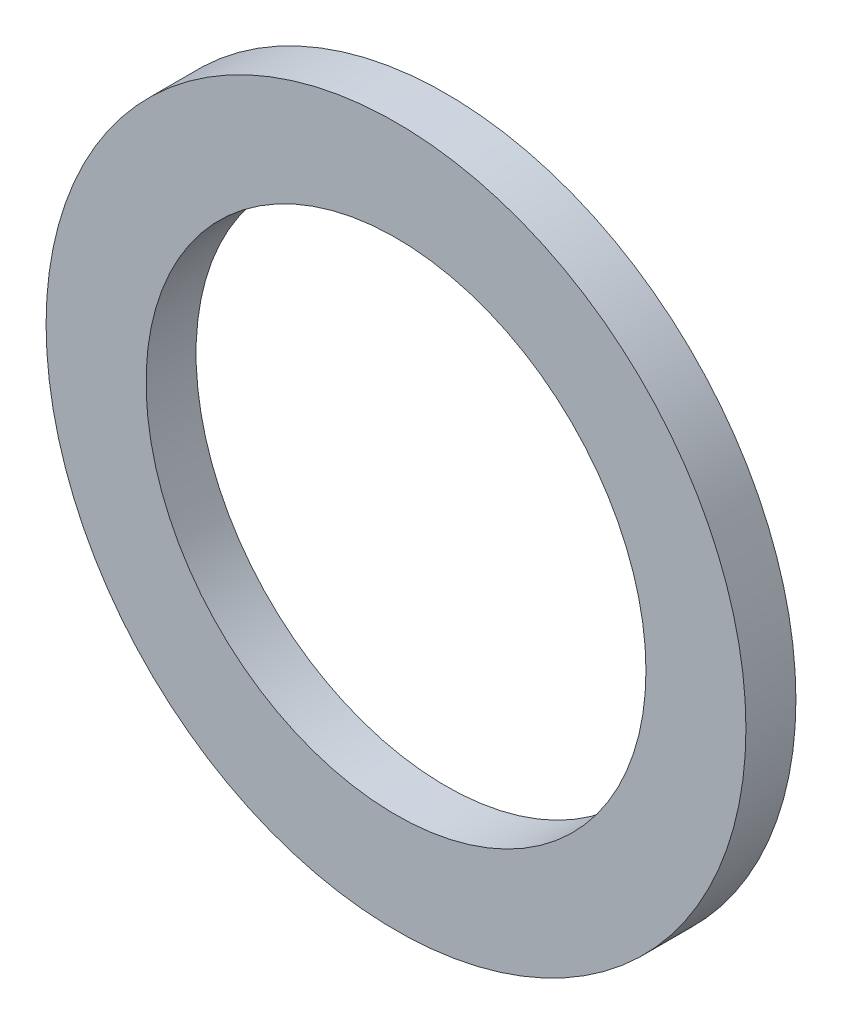
ISO-10303-21;
HEADER;
FILE_DESCRIPTION(('STEP AP214'),'2;1');
FILE_NAME('part.step','',(''),(''),'','','');
FILE_SCHEMA(('AUTOMOTIVE_DESIGN { 1 0 10303 214 1 1 1 1 }'));
ENDSEC;
DATA;
#1=APPLICATION_CONTEXT('core data for automotive mechanical design processes');
#2=APPLICATION_PROTOCOL_DEFINITION('international standard','automotive_design',2000,#1);
#3=PRODUCT_CONTEXT('',#1,'mechanical');
#4=PRODUCT('Part','Part','',(#3));
#5=PRODUCT_RELATED_PRODUCT_CATEGORY('part','',(#4));
#6=PRODUCT_DEFINITION_FORMATION('','',#4);
#7=PRODUCT_DEFINITION_CONTEXT('part definition',#1,'design');
#8=PRODUCT_DEFINITION('design','',#6,#7);
#9=PRODUCT_DEFINITION_SHAPE('','',#8);
#10=(LENGTH_UNIT() NAMED_UNIT(*) SI_UNIT(.MILLI.,.METRE.));
#11=(NAMED_UNIT(*) PLANE_ANGLE_UNIT() SI_UNIT($,.RADIAN.));
#12=(NAMED_UNIT(*) SI_UNIT($,.STERADIAN.) SOLID_ANGLE_UNIT());
#13=UNCERTAINTY_MEASURE_WITH_UNIT(LENGTH_MEASURE(1.E-05),#10,'distance_accuracy_value','');
#14=(GEOMETRIC_REPRESENTATION_CONTEXT(3) GLOBAL_UNCERTAINTY_ASSIGNED_CONTEXT((#13)) GLOBAL_UNIT_ASSIGNED_CONTEXT((#10,
#11,#12)) REPRESENTATION_CONTEXT('',''));
#15=CARTESIAN_POINT('',(0.,0.,0.));
#16=DIRECTION('',(0.,0.,1.));
#17=DIRECTION('',(1.,0.,0.));
#18=AXIS2_PLACEMENT_3D('',#15,#16,#17);
#19=CARTESIAN_POINT('',(0.,0.,5.));
#20=DIRECTION('',(0.,0.,1.));
#21=DIRECTION('',(1.,0.,0.));
#22=AXIS2_PLACEMENT_3D('',#19,#20,#21);
#23=PLANE('',#22);
#24=CARTESIAN_POINT('',(0.,0.,5.));
#25=DIRECTION('',(0.,0.,1.));
#26=DIRECTION('',(1.,0.,0.));
#27=AXIS2_PLACEMENT_3D('',#24,#25,#26);
#28=CIRCLE('',#27,35.);
#29=CARTESIAN_POINT('',(35.,0.,5.));
#30=VERTEX_POINT('',#29);
#31=EDGE_CURVE('E10',#30,#30,#28,.T.);
#32=ORIENTED_EDGE('',*,*,#31,.T.);
#33=EDGE_LOOP('',(#32));
#34=FACE_BOUND('',#33,.T.);
#35=CARTESIAN_POINT('',(0.,0.,5.));
#36=DIRECTION('',(0.,0.,1.));
#37=DIRECTION('',(1.,0.,0.));
#38=AXIS2_PLACEMENT_3D('',#35,#36,#37);
#39=CIRCLE('',#38,25.);
#40=CARTESIAN_POINT('',(25.,0.,5.));
#41=VERTEX_POINT('',#40);
#42=EDGE_CURVE('E50',#41,#41,#39,.T.);
#43=ORIENTED_EDGE('',*,*,#42,.F.);
#44=EDGE_LOOP('',(#43));
#45=FACE_BOUND('',#44,.T.);
#46=ADVANCED_FACE('F37',(#34,#45),#23,.T.);
#47=CARTESIAN_POINT('',(0.,0.,0.));
#48=DIRECTION('',(0.,0.,1.));
#49=DIRECTION('',(1.,0.,0.));
#50=AXIS2_PLACEMENT_3D('',#47,#48,#49);
#51=PLANE('',#50);
#52=CARTESIAN_POINT('',(0.,0.,0.));
#53=DIRECTION('',(0.,0.,1.));
#54=DIRECTION('',(1.,0.,0.));
#55=AXIS2_PLACEMENT_3D('',#52,#53,#54);
#56=CIRCLE('',#55,35.);
#57=CARTESIAN_POINT('',(35.,0.,0.));
#58=VERTEX_POINT('',#57);
#59=EDGE_CURVE('E41',#58,#58,#56,.T.);
#60=ORIENTED_EDGE('',*,*,#59,.F.);
#61=EDGE_LOOP('',(#60));
#62=FACE_BOUND('',#61,.T.);
#63=CARTESIAN_POINT('',(0.,0.,0.));
#64=DIRECTION('',(0.,0.,1.));
#65=DIRECTION('',(1.,0.,0.));
#66=AXIS2_PLACEMENT_3D('',#63,#64,#65);
#67=CIRCLE('',#66,25.);
#68=CARTESIAN_POINT('',(25.,0.,0.));
#69=VERTEX_POINT('',#68);
#70=EDGE_CURVE('E52',#69,#69,#67,.T.);
#71=ORIENTED_EDGE('',*,*,#70,.T.);
#72=EDGE_LOOP('',(#71));
#73=FACE_BOUND('',#72,.T.);
#74=ADVANCED_FACE('F64',(#62,#73),#51,.F.);
#75=CARTESIAN_POINT('',(0.,0.,5.));
#76=DIRECTION('',(0.,0.,-1.));
#77=DIRECTION('',(-1.,0.,0.));
#78=AXIS2_PLACEMENT_3D('',#75,#76,#77);
#79=CYLINDRICAL_SURFACE('',#78,35.);
#80=ORIENTED_EDGE('',*,*,#31,.F.);
#81=EDGE_LOOP('',(#80));
#82=FACE_BOUND('',#81,.T.);
#83=ORIENTED_EDGE('',*,*,#59,.T.);
#84=EDGE_LOOP('',(#83));
#85=FACE_BOUND('',#84,.T.);
#86=ADVANCED_FACE('F39',(#82,#85),#79,.T.);
#87=CARTESIAN_POINT('',(0.,0.,5.));
#88=DIRECTION('',(0.,0.,-1.));
#89=DIRECTION('',(-1.,0.,0.));
#90=AXIS2_PLACEMENT_3D('',#87,#88,#89);
#91=CYLINDRICAL_SURFACE('',#90,25.);
#92=ORIENTED_EDGE('',*,*,#42,.T.);
#93=EDGE_LOOP('',(#92));
#94=FACE_BOUND('',#93,.T.);
#95=ORIENTED_EDGE('',*,*,#70,.F.);
#96=EDGE_LOOP('',(#95));
#97=FACE_BOUND('',#96,.T.);
#98=ADVANCED_FACE('F60',(#94,#97),#91,.F.);
#99=CLOSED_SHELL('',(#46,#74,#86,#98));
#100=MANIFOLD_SOLID_BREP('B2',#99);
#101=ADVANCED_BREP_SHAPE_REPRESENTATION('',(#18,#100),#14);
#102=SHAPE_DEFINITION_REPRESENTATION(#9,#101);
ENDSEC;
END-ISO-10303-21;
